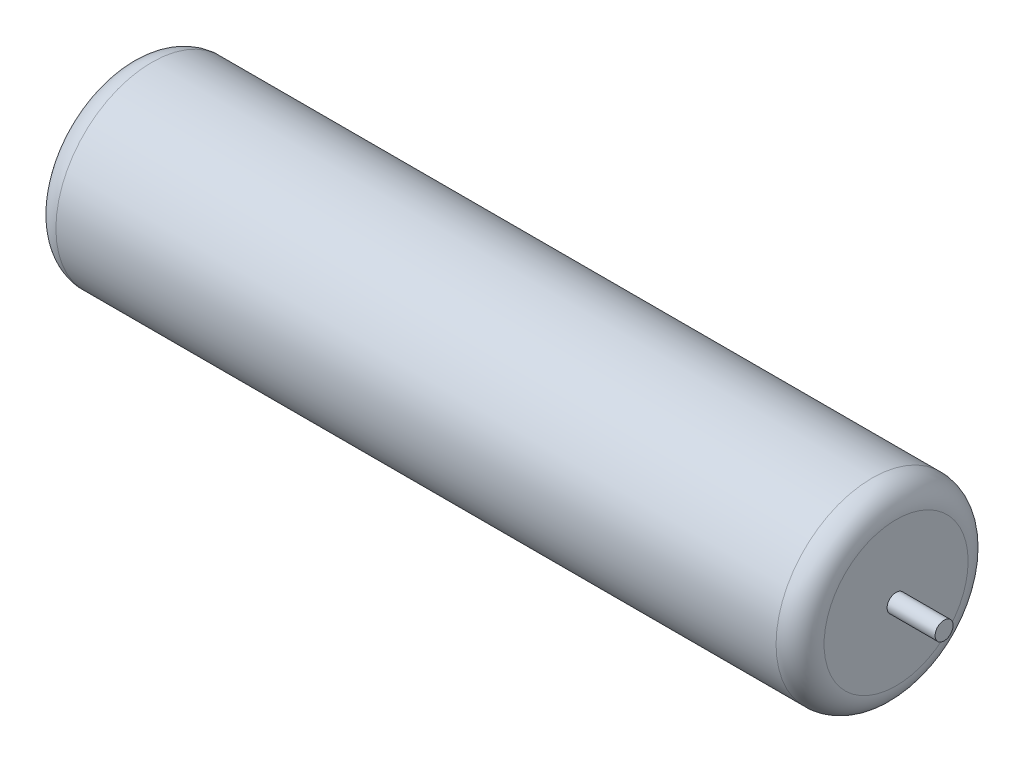
ISO-10303-21;
HEADER;
FILE_DESCRIPTION(('STEP AP214'),'2;1');
FILE_NAME('part.step','',(''),(''),'','','');
FILE_SCHEMA(('AUTOMOTIVE_DESIGN { 1 0 10303 214 1 1 1 1 }'));
ENDSEC;
DATA;
#1=APPLICATION_CONTEXT('core data for automotive mechanical design processes');
#2=APPLICATION_PROTOCOL_DEFINITION('international standard','automotive_design',2000,#1);
#3=PRODUCT_CONTEXT('',#1,'mechanical');
#4=PRODUCT('Part','Part','',(#3));
#5=PRODUCT_RELATED_PRODUCT_CATEGORY('part','',(#4));
#6=PRODUCT_DEFINITION_FORMATION('','',#4);
#7=PRODUCT_DEFINITION_CONTEXT('part definition',#1,'design');
#8=PRODUCT_DEFINITION('design','',#6,#7);
#9=PRODUCT_DEFINITION_SHAPE('','',#8);
#10=(LENGTH_UNIT() NAMED_UNIT(*) SI_UNIT(.MILLI.,.METRE.));
#11=(NAMED_UNIT(*) PLANE_ANGLE_UNIT() SI_UNIT($,.RADIAN.));
#12=(NAMED_UNIT(*) SI_UNIT($,.STERADIAN.) SOLID_ANGLE_UNIT());
#13=UNCERTAINTY_MEASURE_WITH_UNIT(LENGTH_MEASURE(1.E-05),#10,'distance_accuracy_value','');
#14=(GEOMETRIC_REPRESENTATION_CONTEXT(3) GLOBAL_UNCERTAINTY_ASSIGNED_CONTEXT((#13)) GLOBAL_UNIT_ASSIGNED_CONTEXT((#10,
#11,#12)) REPRESENTATION_CONTEXT('',''));
#15=CARTESIAN_POINT('',(0.,0.,0.));
#16=DIRECTION('',(0.,0.,1.));
#17=DIRECTION('',(1.,0.,0.));
#18=AXIS2_PLACEMENT_3D('',#15,#16,#17);
#19=CARTESIAN_POINT('',(32.,0.,0.));
#20=DIRECTION('',(-1.,0.,0.));
#21=DIRECTION('',(0.,0.,1.));
#22=AXIS2_PLACEMENT_3D('',#19,#20,#21);
#23=CYLINDRICAL_SURFACE('',#22,4.);
#24=CARTESIAN_POINT('',(31.,0.,0.));
#25=DIRECTION('',(1.,0.,0.));
#26=DIRECTION('',(0.,0.,-1.));
#27=AXIS2_PLACEMENT_3D('',#24,#25,#26);
#28=CIRCLE('',#27,4.);
#29=CARTESIAN_POINT('',(31.,0.,-4.));
#30=VERTEX_POINT('',#29);
#31=EDGE_CURVE('E44',#30,#30,#28,.F.);
#32=ORIENTED_EDGE('',*,*,#31,.T.);
#33=EDGE_LOOP('',(#32));
#34=FACE_BOUND('',#33,.T.);
#35=CARTESIAN_POINT('',(1.,0.,0.));
#36=DIRECTION('',(1.,0.,0.));
#37=DIRECTION('',(0.,0.,-1.));
#38=AXIS2_PLACEMENT_3D('',#35,#36,#37);
#39=CIRCLE('',#38,4.);
#40=CARTESIAN_POINT('',(1.,0.,-4.));
#41=VERTEX_POINT('',#40);
#42=EDGE_CURVE('E52',#41,#41,#39,.T.);
#43=ORIENTED_EDGE('',*,*,#42,.T.);
#44=EDGE_LOOP('',(#43));
#45=FACE_BOUND('',#44,.T.);
#46=ADVANCED_FACE('F31',(#34,#45),#23,.T.);
#47=CARTESIAN_POINT('',(32.,0.,0.));
#48=DIRECTION('',(1.,0.,0.));
#49=DIRECTION('',(0.,0.,-1.));
#50=AXIS2_PLACEMENT_3D('',#47,#48,#49);
#51=PLANE('',#50);
#52=CARTESIAN_POINT('',(32.,0.,0.));
#53=DIRECTION('',(1.,0.,0.));
#54=DIRECTION('',(0.,0.,-1.));
#55=AXIS2_PLACEMENT_3D('',#52,#53,#54);
#56=CIRCLE('',#55,0.375);
#57=CARTESIAN_POINT('',(32.,0.,-0.375));
#58=VERTEX_POINT('',#57);
#59=EDGE_CURVE('E10',#58,#58,#56,.T.);
#60=ORIENTED_EDGE('',*,*,#59,.F.);
#61=EDGE_LOOP('',(#60));
#62=FACE_BOUND('',#61,.T.);
#63=CARTESIAN_POINT('',(32.,0.,0.));
#64=DIRECTION('',(1.,0.,0.));
#65=DIRECTION('',(0.,0.,-1.));
#66=AXIS2_PLACEMENT_3D('',#63,#64,#65);
#67=CIRCLE('',#66,3.);
#68=CARTESIAN_POINT('',(32.,0.,-3.));
#69=VERTEX_POINT('',#68);
#70=EDGE_CURVE('E49',#69,#69,#67,.T.);
#71=ORIENTED_EDGE('',*,*,#70,.T.);
#72=EDGE_LOOP('',(#71));
#73=FACE_BOUND('',#72,.T.);
#74=ADVANCED_FACE('F66',(#62,#73),#51,.T.);
#75=CARTESIAN_POINT('',(0.,0.,0.));
#76=DIRECTION('',(1.,0.,0.));
#77=DIRECTION('',(0.,0.,-1.));
#78=AXIS2_PLACEMENT_3D('',#75,#76,#77);
#79=PLANE('',#78);
#80=CARTESIAN_POINT('',(0.,0.,0.));
#81=DIRECTION('',(1.,0.,0.));
#82=DIRECTION('',(0.,0.,-1.));
#83=AXIS2_PLACEMENT_3D('',#80,#81,#82);
#84=CIRCLE('',#83,0.375);
#85=CARTESIAN_POINT('',(0.,0.,-0.375));
#86=VERTEX_POINT('',#85);
#87=EDGE_CURVE('E35',#86,#86,#84,.T.);
#88=ORIENTED_EDGE('',*,*,#87,.T.);
#89=EDGE_LOOP('',(#88));
#90=FACE_BOUND('',#89,.T.);
#91=CARTESIAN_POINT('',(0.,0.,0.));
#92=DIRECTION('',(1.,0.,0.));
#93=DIRECTION('',(0.,0.,-1.));
#94=AXIS2_PLACEMENT_3D('',#91,#92,#93);
#95=CIRCLE('',#94,3.);
#96=CARTESIAN_POINT('',(0.,0.,-3.));
#97=VERTEX_POINT('',#96);
#98=EDGE_CURVE('E39',#97,#97,#95,.F.);
#99=ORIENTED_EDGE('',*,*,#98,.T.);
#100=EDGE_LOOP('',(#99));
#101=FACE_BOUND('',#100,.T.);
#102=ADVANCED_FACE('F63',(#90,#101),#79,.F.);
#103=CARTESIAN_POINT('',(31.,0.,0.));
#104=DIRECTION('',(1.,0.,0.));
#105=DIRECTION('',(0.,0.,-1.));
#106=AXIS2_PLACEMENT_3D('',#103,#104,#105);
#107=TOROIDAL_SURFACE('',#106,3.,1.);
#108=ORIENTED_EDGE('',*,*,#31,.F.);
#109=EDGE_LOOP('',(#108));
#110=FACE_BOUND('',#109,.T.);
#111=ORIENTED_EDGE('',*,*,#70,.F.);
#112=EDGE_LOOP('',(#111));
#113=FACE_BOUND('',#112,.T.);
#114=ADVANCED_FACE('F60',(#110,#113),#107,.T.);
#115=CARTESIAN_POINT('',(1.,0.,0.));
#116=DIRECTION('',(1.,0.,0.));
#117=DIRECTION('',(0.,0.,-1.));
#118=AXIS2_PLACEMENT_3D('',#115,#116,#117);
#119=TOROIDAL_SURFACE('',#118,3.,1.);
#120=ORIENTED_EDGE('',*,*,#98,.F.);
#121=EDGE_LOOP('',(#120));
#122=FACE_BOUND('',#121,.T.);
#123=ORIENTED_EDGE('',*,*,#42,.F.);
#124=EDGE_LOOP('',(#123));
#125=FACE_BOUND('',#124,.T.);
#126=ADVANCED_FACE('F33',(#122,#125),#119,.T.);
#127=CARTESIAN_POINT('',(-1.,0.,0.));
#128=DIRECTION('',(-1.,0.,0.));
#129=DIRECTION('',(0.,0.,1.));
#130=AXIS2_PLACEMENT_3D('',#127,#128,#129);
#131=PLANE('',#130);
#132=CARTESIAN_POINT('',(-1.,0.,0.));
#133=DIRECTION('',(-1.,0.,0.));
#134=DIRECTION('',(0.,0.,1.));
#135=AXIS2_PLACEMENT_3D('',#132,#133,#134);
#136=CIRCLE('',#135,0.375);
#137=CARTESIAN_POINT('',(-1.,0.,0.375));
#138=VERTEX_POINT('',#137);
#139=EDGE_CURVE('E97',#138,#138,#136,.T.);
#140=ORIENTED_EDGE('',*,*,#139,.T.);
#141=EDGE_LOOP('',(#140));
#142=FACE_BOUND('',#141,.T.);
#143=ADVANCED_FACE('F86',(#142),#131,.T.);
#144=CARTESIAN_POINT('',(34.,0.,0.));
#145=DIRECTION('',(-1.,0.,0.));
#146=DIRECTION('',(0.,0.,1.));
#147=AXIS2_PLACEMENT_3D('',#144,#145,#146);
#148=CYLINDRICAL_SURFACE('',#147,0.375);
#149=ORIENTED_EDGE('',*,*,#139,.F.);
#150=EDGE_LOOP('',(#149));
#151=FACE_BOUND('',#150,.T.);
#152=ORIENTED_EDGE('',*,*,#87,.F.);
#153=EDGE_LOOP('',(#152));
#154=FACE_BOUND('',#153,.T.);
#155=ADVANCED_FACE('F82',(#151,#154),#148,.T.);
#156=ORIENTED_EDGE('',*,*,#59,.T.);
#157=EDGE_LOOP('',(#156));
#158=FACE_BOUND('',#157,.T.);
#159=CARTESIAN_POINT('',(34.,0.,0.));
#160=DIRECTION('',(-1.,0.,0.));
#161=DIRECTION('',(0.,0.,1.));
#162=AXIS2_PLACEMENT_3D('',#159,#160,#161);
#163=CIRCLE('',#162,0.375);
#164=CARTESIAN_POINT('',(34.,0.,0.375));
#165=VERTEX_POINT('',#164);
#166=EDGE_CURVE('E47',#165,#165,#163,.T.);
#167=ORIENTED_EDGE('',*,*,#166,.T.);
#168=EDGE_LOOP('',(#167));
#169=FACE_BOUND('',#168,.T.);
#170=ADVANCED_FACE('F78',(#158,#169),#148,.T.);
#171=CARTESIAN_POINT('',(34.,0.,0.));
#172=DIRECTION('',(-1.,0.,0.));
#173=DIRECTION('',(0.,0.,1.));
#174=AXIS2_PLACEMENT_3D('',#171,#172,#173);
#175=PLANE('',#174);
#176=ORIENTED_EDGE('',*,*,#166,.F.);
#177=EDGE_LOOP('',(#176));
#178=FACE_BOUND('',#177,.T.);
#179=ADVANCED_FACE('F81',(#178),#175,.F.);
#180=CLOSED_SHELL('',(#46,#74,#102,#114,#126,#143,#155,#170,#179));
#181=MANIFOLD_SOLID_BREP('B2',#180);
#182=ADVANCED_BREP_SHAPE_REPRESENTATION('',(#18,#181),#14);
#183=SHAPE_DEFINITION_REPRESENTATION(#9,#182);
ENDSEC;
END-ISO-10303-21;
